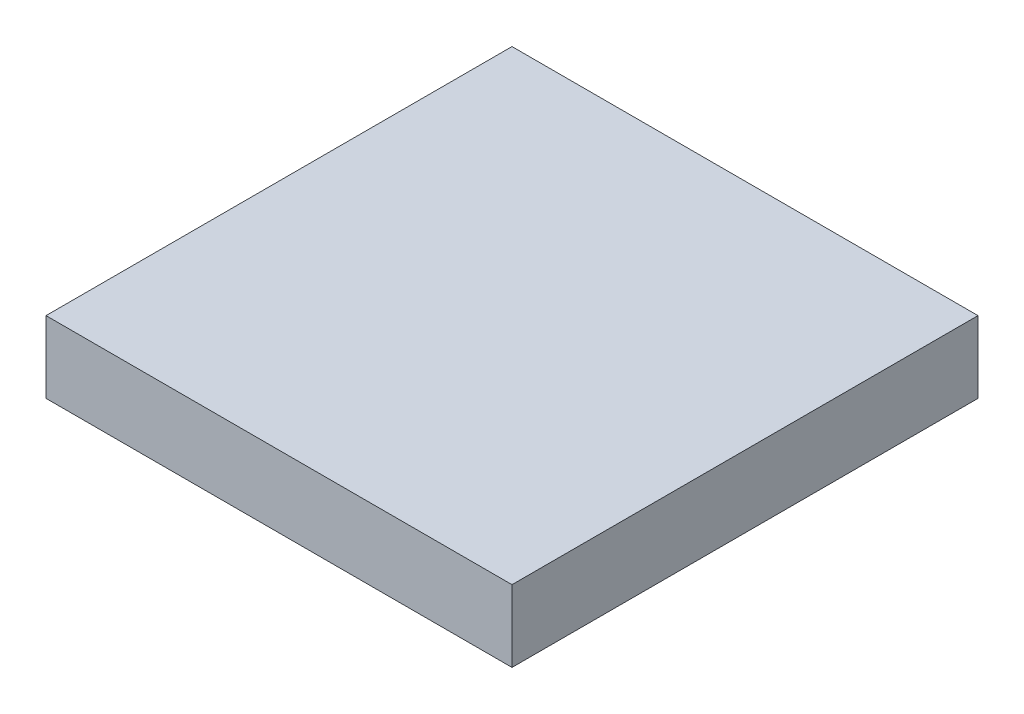
ISO-10303-21;
HEADER;
FILE_DESCRIPTION(('STEP AP214'),'2;1');
FILE_NAME('part.step','',(''),(''),'','','');
FILE_SCHEMA(('AUTOMOTIVE_DESIGN { 1 0 10303 214 1 1 1 1 }'));
ENDSEC;
DATA;
#1=APPLICATION_CONTEXT('core data for automotive mechanical design processes');
#2=APPLICATION_PROTOCOL_DEFINITION('international standard','automotive_design',2000,#1);
#3=PRODUCT_CONTEXT('',#1,'mechanical');
#4=PRODUCT('Part','Part','',(#3));
#5=PRODUCT_RELATED_PRODUCT_CATEGORY('part','',(#4));
#6=PRODUCT_DEFINITION_FORMATION('','',#4);
#7=PRODUCT_DEFINITION_CONTEXT('part definition',#1,'design');
#8=PRODUCT_DEFINITION('design','',#6,#7);
#9=PRODUCT_DEFINITION_SHAPE('','',#8);
#10=(LENGTH_UNIT() NAMED_UNIT(*) SI_UNIT(.MILLI.,.METRE.));
#11=(NAMED_UNIT(*) PLANE_ANGLE_UNIT() SI_UNIT($,.RADIAN.));
#12=(NAMED_UNIT(*) SI_UNIT($,.STERADIAN.) SOLID_ANGLE_UNIT());
#13=UNCERTAINTY_MEASURE_WITH_UNIT(LENGTH_MEASURE(1.E-05),#10,'distance_accuracy_value','');
#14=(GEOMETRIC_REPRESENTATION_CONTEXT(3) GLOBAL_UNCERTAINTY_ASSIGNED_CONTEXT((#13)) GLOBAL_UNIT_ASSIGNED_CONTEXT((#10,
#11,#12)) REPRESENTATION_CONTEXT('',''));
#15=CARTESIAN_POINT('',(0.,0.,0.));
#16=DIRECTION('',(0.,0.,1.));
#17=DIRECTION('',(1.,0.,0.));
#18=AXIS2_PLACEMENT_3D('',#15,#16,#17);
#19=CARTESIAN_POINT('',(0.,0.,0.));
#20=DIRECTION('',(0.,-1.,0.));
#21=DIRECTION('',(0.,0.,-1.));
#22=AXIS2_PLACEMENT_3D('',#19,#20,#21);
#23=PLANE('',#22);
#24=DIRECTION('',(0.,0.,-1.));
#25=VECTOR('',#24,1.);
#26=CARTESIAN_POINT('',(8.255,0.,8.255));
#27=LINE('',#26,#25);
#28=CARTESIAN_POINT('',(8.255,0.,8.255));
#29=VERTEX_POINT('',#28);
#30=CARTESIAN_POINT('',(8.255,0.,-8.255));
#31=VERTEX_POINT('',#30);
#32=EDGE_CURVE('E202',#29,#31,#27,.T.);
#33=ORIENTED_EDGE('',*,*,#32,.F.);
#34=DIRECTION('',(1.,0.,0.));
#35=VECTOR('',#34,1.);
#36=CARTESIAN_POINT('',(-8.255,0.,8.255));
#37=LINE('',#36,#35);
#38=CARTESIAN_POINT('',(-8.255,0.,8.255));
#39=VERTEX_POINT('',#38);
#40=EDGE_CURVE('E208',#39,#29,#37,.T.);
#41=ORIENTED_EDGE('',*,*,#40,.F.);
#42=DIRECTION('',(0.,0.,1.));
#43=VECTOR('',#42,1.);
#44=CARTESIAN_POINT('',(-8.255,0.,8.255));
#45=LINE('',#44,#43);
#46=CARTESIAN_POINT('',(-8.255,0.,-8.255));
#47=VERTEX_POINT('',#46);
#48=EDGE_CURVE('E224',#47,#39,#45,.T.);
#49=ORIENTED_EDGE('',*,*,#48,.F.);
#50=DIRECTION('',(-1.,0.,0.));
#51=VECTOR('',#50,1.);
#52=CARTESIAN_POINT('',(-8.255,0.,-8.255));
#53=LINE('',#52,#51);
#54=EDGE_CURVE('E221',#31,#47,#53,.T.);
#55=ORIENTED_EDGE('',*,*,#54,.F.);
#56=EDGE_LOOP('',(#33,#41,#49,#55));
#57=FACE_BOUND('',#56,.T.);
#58=DIRECTION('',(-1.,0.,0.));
#59=VECTOR('',#58,1.);
#60=CARTESIAN_POINT('',(-4.953,0.,-2.41299999999999));
#61=LINE('',#60,#59);
#62=CARTESIAN_POINT('',(-3.937,0.,-2.41299999999999));
#63=VERTEX_POINT('',#62);
#64=CARTESIAN_POINT('',(-4.953,0.,-2.41299999999999));
#65=VERTEX_POINT('',#64);
#66=EDGE_CURVE('E163',#63,#65,#61,.T.);
#67=ORIENTED_EDGE('',*,*,#66,.F.);
#68=DIRECTION('',(0.,0.,1.));
#69=VECTOR('',#68,1.);
#70=CARTESIAN_POINT('',(-3.937,0.,-5.71499999999999));
#71=LINE('',#70,#69);
#72=CARTESIAN_POINT('',(-3.937,0.,-5.71499999999999));
#73=VERTEX_POINT('',#72);
#74=EDGE_CURVE('E158',#73,#63,#71,.T.);
#75=ORIENTED_EDGE('',*,*,#74,.F.);
#76=DIRECTION('',(1.,0.,0.));
#77=VECTOR('',#76,1.);
#78=CARTESIAN_POINT('',(-4.953,0.,-5.71499999999999));
#79=LINE('',#78,#77);
#80=CARTESIAN_POINT('',(-4.953,0.,-5.71499999999999));
#81=VERTEX_POINT('',#80);
#82=EDGE_CURVE('E173',#81,#73,#79,.T.);
#83=ORIENTED_EDGE('',*,*,#82,.F.);
#84=DIRECTION('',(0.,0.,-1.));
#85=VECTOR('',#84,1.);
#86=CARTESIAN_POINT('',(-4.953,0.,-5.71499999999999));
#87=LINE('',#86,#85);
#88=EDGE_CURVE('E185',#65,#81,#87,.T.);
#89=ORIENTED_EDGE('',*,*,#88,.F.);
#90=EDGE_LOOP('',(#67,#75,#83,#89));
#91=FACE_BOUND('',#90,.T.);
#92=DIRECTION('',(-1.,0.,0.));
#93=VECTOR('',#92,1.);
#94=CARTESIAN_POINT('',(2.413,0.,4.953));
#95=LINE('',#94,#93);
#96=CARTESIAN_POINT('',(5.715,0.,4.953));
#97=VERTEX_POINT('',#96);
#98=CARTESIAN_POINT('',(2.413,0.,4.953));
#99=VERTEX_POINT('',#98);
#100=EDGE_CURVE('E405',#97,#99,#95,.T.);
#101=ORIENTED_EDGE('',*,*,#100,.F.);
#102=DIRECTION('',(0.,0.,1.));
#103=VECTOR('',#102,1.);
#104=CARTESIAN_POINT('',(5.715,0.,3.937));
#105=LINE('',#104,#103);
#106=CARTESIAN_POINT('',(5.715,0.,3.937));
#107=VERTEX_POINT('',#106);
#108=EDGE_CURVE('E155',#107,#97,#105,.T.);
#109=ORIENTED_EDGE('',*,*,#108,.F.);
#110=DIRECTION('',(1.,0.,0.));
#111=VECTOR('',#110,1.);
#112=CARTESIAN_POINT('',(2.413,0.,3.937));
#113=LINE('',#112,#111);
#114=CARTESIAN_POINT('',(2.413,0.,3.937));
#115=VERTEX_POINT('',#114);
#116=EDGE_CURVE('E151',#115,#107,#113,.T.);
#117=ORIENTED_EDGE('',*,*,#116,.F.);
#118=DIRECTION('',(0.,0.,-1.));
#119=VECTOR('',#118,1.);
#120=CARTESIAN_POINT('',(2.413,0.,3.937));
#121=LINE('',#120,#119);
#122=EDGE_CURVE('E401',#99,#115,#121,.T.);
#123=ORIENTED_EDGE('',*,*,#122,.F.);
#124=EDGE_LOOP('',(#101,#109,#117,#123));
#125=FACE_BOUND('',#124,.T.);
#126=ADVANCED_FACE('F39',(#57,#91,#125),#23,.T.);
#127=CARTESIAN_POINT('',(8.255,2.54,8.255));
#128=DIRECTION('',(-1.,0.,0.));
#129=DIRECTION('',(0.,0.,1.));
#130=AXIS2_PLACEMENT_3D('',#127,#128,#129);
#131=PLANE('',#130);
#132=ORIENTED_EDGE('',*,*,#32,.T.);
#133=DIRECTION('',(0.,-1.,0.));
#134=VECTOR('',#133,1.);
#135=CARTESIAN_POINT('',(8.255,2.54,-8.255));
#136=LINE('',#135,#134);
#137=CARTESIAN_POINT('',(8.255,2.54,-8.255));
#138=VERTEX_POINT('',#137);
#139=EDGE_CURVE('E11',#138,#31,#136,.T.);
#140=ORIENTED_EDGE('',*,*,#139,.F.);
#141=DIRECTION('',(0.,0.,-1.));
#142=VECTOR('',#141,1.);
#143=CARTESIAN_POINT('',(8.255,2.54,8.255));
#144=LINE('',#143,#142);
#145=CARTESIAN_POINT('',(8.255,2.54,8.255));
#146=VERTEX_POINT('',#145);
#147=EDGE_CURVE('E203',#146,#138,#144,.T.);
#148=ORIENTED_EDGE('',*,*,#147,.F.);
#149=DIRECTION('',(0.,-1.,0.));
#150=VECTOR('',#149,1.);
#151=CARTESIAN_POINT('',(8.255,2.54,8.255));
#152=LINE('',#151,#150);
#153=EDGE_CURVE('E217',#146,#29,#152,.T.);
#154=ORIENTED_EDGE('',*,*,#153,.T.);
#155=EDGE_LOOP('',(#132,#140,#148,#154));
#156=FACE_BOUND('',#155,.T.);
#157=ADVANCED_FACE('F41',(#156),#131,.F.);
#158=CARTESIAN_POINT('',(-8.255,2.54,-8.255));
#159=DIRECTION('',(0.,0.,1.));
#160=DIRECTION('',(1.,0.,0.));
#161=AXIS2_PLACEMENT_3D('',#158,#159,#160);
#162=PLANE('',#161);
#163=ORIENTED_EDGE('',*,*,#54,.T.);
#164=DIRECTION('',(0.,-1.,0.));
#165=VECTOR('',#164,1.);
#166=CARTESIAN_POINT('',(-8.255,2.54,-8.255));
#167=LINE('',#166,#165);
#168=CARTESIAN_POINT('',(-8.255,2.54,-8.255));
#169=VERTEX_POINT('',#168);
#170=EDGE_CURVE('E48',#169,#47,#167,.T.);
#171=ORIENTED_EDGE('',*,*,#170,.F.);
#172=DIRECTION('',(-1.,0.,0.));
#173=VECTOR('',#172,1.);
#174=CARTESIAN_POINT('',(-8.255,2.54,-8.255));
#175=LINE('',#174,#173);
#176=EDGE_CURVE('E207',#138,#169,#175,.T.);
#177=ORIENTED_EDGE('',*,*,#176,.F.);
#178=ORIENTED_EDGE('',*,*,#139,.T.);
#179=EDGE_LOOP('',(#163,#171,#177,#178));
#180=FACE_BOUND('',#179,.T.);
#181=ADVANCED_FACE('F257',(#180),#162,.F.);
#182=CARTESIAN_POINT('',(-8.255,2.54,8.255));
#183=DIRECTION('',(1.,0.,0.));
#184=DIRECTION('',(0.,0.,-1.));
#185=AXIS2_PLACEMENT_3D('',#182,#183,#184);
#186=PLANE('',#185);
#187=ORIENTED_EDGE('',*,*,#48,.T.);
#188=DIRECTION('',(0.,-1.,0.));
#189=VECTOR('',#188,1.);
#190=CARTESIAN_POINT('',(-8.255,2.54,8.255));
#191=LINE('',#190,#189);
#192=CARTESIAN_POINT('',(-8.255,2.54,8.255));
#193=VERTEX_POINT('',#192);
#194=EDGE_CURVE('E232',#193,#39,#191,.T.);
#195=ORIENTED_EDGE('',*,*,#194,.F.);
#196=DIRECTION('',(0.,0.,1.));
#197=VECTOR('',#196,1.);
#198=CARTESIAN_POINT('',(-8.255,2.54,8.255));
#199=LINE('',#198,#197);
#200=EDGE_CURVE('E211',#169,#193,#199,.T.);
#201=ORIENTED_EDGE('',*,*,#200,.F.);
#202=ORIENTED_EDGE('',*,*,#170,.T.);
#203=EDGE_LOOP('',(#187,#195,#201,#202));
#204=FACE_BOUND('',#203,.T.);
#205=ADVANCED_FACE('F241',(#204),#186,.F.);
#206=CARTESIAN_POINT('',(-8.255,2.54,8.255));
#207=DIRECTION('',(0.,0.,-1.));
#208=DIRECTION('',(-1.,0.,0.));
#209=AXIS2_PLACEMENT_3D('',#206,#207,#208);
#210=PLANE('',#209);
#211=ORIENTED_EDGE('',*,*,#40,.T.);
#212=ORIENTED_EDGE('',*,*,#153,.F.);
#213=DIRECTION('',(1.,0.,0.));
#214=VECTOR('',#213,1.);
#215=CARTESIAN_POINT('',(-8.255,2.54,8.255));
#216=LINE('',#215,#214);
#217=EDGE_CURVE('E214',#193,#146,#216,.T.);
#218=ORIENTED_EDGE('',*,*,#217,.F.);
#219=ORIENTED_EDGE('',*,*,#194,.T.);
#220=EDGE_LOOP('',(#211,#212,#218,#219));
#221=FACE_BOUND('',#220,.T.);
#222=ADVANCED_FACE('F250',(#221),#210,.F.);
#223=CARTESIAN_POINT('',(0.,2.54,0.));
#224=DIRECTION('',(0.,-1.,0.));
#225=DIRECTION('',(0.,0.,-1.));
#226=AXIS2_PLACEMENT_3D('',#223,#224,#225);
#227=PLANE('',#226);
#228=ORIENTED_EDGE('',*,*,#147,.T.);
#229=ORIENTED_EDGE('',*,*,#176,.T.);
#230=ORIENTED_EDGE('',*,*,#200,.T.);
#231=ORIENTED_EDGE('',*,*,#217,.T.);
#232=EDGE_LOOP('',(#228,#229,#230,#231));
#233=FACE_BOUND('',#232,.T.);
#234=ADVANCED_FACE('F256',(#233),#227,.F.);
#235=CARTESIAN_POINT('',(-3.937,-2.032,-5.71499999999999));
#236=DIRECTION('',(-1.,0.,0.));
#237=DIRECTION('',(0.,0.,1.));
#238=AXIS2_PLACEMENT_3D('',#235,#236,#237);
#239=PLANE('',#238);
#240=ORIENTED_EDGE('',*,*,#74,.T.);
#241=DIRECTION('',(0.,1.,0.));
#242=VECTOR('',#241,1.);
#243=CARTESIAN_POINT('',(-3.937,-2.032,-2.41299999999999));
#244=LINE('',#243,#242);
#245=CARTESIAN_POINT('',(-3.937,-2.032,-2.41299999999999));
#246=VERTEX_POINT('',#245);
#247=EDGE_CURVE('E199',#246,#63,#244,.T.);
#248=ORIENTED_EDGE('',*,*,#247,.F.);
#249=DIRECTION('',(0.,0.,1.));
#250=VECTOR('',#249,1.);
#251=CARTESIAN_POINT('',(-3.937,-2.032,-5.71499999999999));
#252=LINE('',#251,#250);
#253=CARTESIAN_POINT('',(-3.937,-2.032,-5.71499999999999));
#254=VERTEX_POINT('',#253);
#255=EDGE_CURVE('E168',#254,#246,#252,.T.);
#256=ORIENTED_EDGE('',*,*,#255,.F.);
#257=DIRECTION('',(0.,1.,0.));
#258=VECTOR('',#257,1.);
#259=CARTESIAN_POINT('',(-3.937,-2.032,-5.71499999999999));
#260=LINE('',#259,#258);
#261=EDGE_CURVE('E181',#254,#73,#260,.T.);
#262=ORIENTED_EDGE('',*,*,#261,.T.);
#263=EDGE_LOOP('',(#240,#248,#256,#262));
#264=FACE_BOUND('',#263,.T.);
#265=ADVANCED_FACE('F275',(#264),#239,.F.);
#266=CARTESIAN_POINT('',(-4.953,-2.032,-2.41299999999999));
#267=DIRECTION('',(0.,0.,-1.));
#268=DIRECTION('',(-1.,0.,0.));
#269=AXIS2_PLACEMENT_3D('',#266,#267,#268);
#270=PLANE('',#269);
#271=ORIENTED_EDGE('',*,*,#66,.T.);
#272=DIRECTION('',(0.,1.,0.));
#273=VECTOR('',#272,1.);
#274=CARTESIAN_POINT('',(-4.953,-2.032,-2.41299999999999));
#275=LINE('',#274,#273);
#276=CARTESIAN_POINT('',(-4.953,-2.032,-2.41299999999999));
#277=VERTEX_POINT('',#276);
#278=EDGE_CURVE('E195',#277,#65,#275,.T.);
#279=ORIENTED_EDGE('',*,*,#278,.F.);
#280=DIRECTION('',(-1.,0.,0.));
#281=VECTOR('',#280,1.);
#282=CARTESIAN_POINT('',(-4.953,-2.032,-2.41299999999999));
#283=LINE('',#282,#281);
#284=EDGE_CURVE('E172',#246,#277,#283,.T.);
#285=ORIENTED_EDGE('',*,*,#284,.F.);
#286=ORIENTED_EDGE('',*,*,#247,.T.);
#287=EDGE_LOOP('',(#271,#279,#285,#286));
#288=FACE_BOUND('',#287,.T.);
#289=ADVANCED_FACE('F279',(#288),#270,.F.);
#290=CARTESIAN_POINT('',(-4.953,-2.032,-5.71499999999999));
#291=DIRECTION('',(1.,0.,0.));
#292=DIRECTION('',(0.,0.,-1.));
#293=AXIS2_PLACEMENT_3D('',#290,#291,#292);
#294=PLANE('',#293);
#295=ORIENTED_EDGE('',*,*,#88,.T.);
#296=DIRECTION('',(0.,1.,0.));
#297=VECTOR('',#296,1.);
#298=CARTESIAN_POINT('',(-4.953,-2.032,-5.71499999999999));
#299=LINE('',#298,#297);
#300=CARTESIAN_POINT('',(-4.953,-2.032,-5.71499999999999));
#301=VERTEX_POINT('',#300);
#302=EDGE_CURVE('E63',#301,#81,#299,.T.);
#303=ORIENTED_EDGE('',*,*,#302,.F.);
#304=DIRECTION('',(0.,0.,-1.));
#305=VECTOR('',#304,1.);
#306=CARTESIAN_POINT('',(-4.953,-2.032,-5.71499999999999));
#307=LINE('',#306,#305);
#308=EDGE_CURVE('E176',#277,#301,#307,.T.);
#309=ORIENTED_EDGE('',*,*,#308,.F.);
#310=ORIENTED_EDGE('',*,*,#278,.T.);
#311=EDGE_LOOP('',(#295,#303,#309,#310));
#312=FACE_BOUND('',#311,.T.);
#313=ADVANCED_FACE('F284',(#312),#294,.F.);
#314=CARTESIAN_POINT('',(-4.953,-2.032,-5.71499999999999));
#315=DIRECTION('',(0.,0.,1.));
#316=DIRECTION('',(1.,0.,0.));
#317=AXIS2_PLACEMENT_3D('',#314,#315,#316);
#318=PLANE('',#317);
#319=ORIENTED_EDGE('',*,*,#82,.T.);
#320=ORIENTED_EDGE('',*,*,#261,.F.);
#321=DIRECTION('',(1.,0.,0.));
#322=VECTOR('',#321,1.);
#323=CARTESIAN_POINT('',(-4.953,-2.032,-5.71499999999999));
#324=LINE('',#323,#322);
#325=EDGE_CURVE('E179',#301,#254,#324,.T.);
#326=ORIENTED_EDGE('',*,*,#325,.F.);
#327=ORIENTED_EDGE('',*,*,#302,.T.);
#328=EDGE_LOOP('',(#319,#320,#326,#327));
#329=FACE_BOUND('',#328,.T.);
#330=ADVANCED_FACE('F290',(#329),#318,.F.);
#331=CARTESIAN_POINT('',(0.,-2.032,0.));
#332=DIRECTION('',(0.,1.,0.));
#333=DIRECTION('',(0.,0.,1.));
#334=AXIS2_PLACEMENT_3D('',#331,#332,#333);
#335=PLANE('',#334);
#336=ORIENTED_EDGE('',*,*,#255,.T.);
#337=ORIENTED_EDGE('',*,*,#284,.T.);
#338=ORIENTED_EDGE('',*,*,#308,.T.);
#339=ORIENTED_EDGE('',*,*,#325,.T.);
#340=EDGE_LOOP('',(#336,#337,#338,#339));
#341=FACE_BOUND('',#340,.T.);
#342=ADVANCED_FACE('F294',(#341),#335,.F.);
#343=CARTESIAN_POINT('',(5.715,-2.032,3.937));
#344=DIRECTION('',(-1.,0.,0.));
#345=DIRECTION('',(0.,0.,1.));
#346=AXIS2_PLACEMENT_3D('',#343,#344,#345);
#347=PLANE('',#346);
#348=ORIENTED_EDGE('',*,*,#108,.T.);
#349=DIRECTION('',(0.,1.,0.));
#350=VECTOR('',#349,1.);
#351=CARTESIAN_POINT('',(5.715,-2.032,4.953));
#352=LINE('',#351,#350);
#353=CARTESIAN_POINT('',(5.715,-2.032,4.953));
#354=VERTEX_POINT('',#353);
#355=EDGE_CURVE('E134',#354,#97,#352,.T.);
#356=ORIENTED_EDGE('',*,*,#355,.F.);
#357=DIRECTION('',(0.,0.,1.));
#358=VECTOR('',#357,1.);
#359=CARTESIAN_POINT('',(5.715,-2.032,3.937));
#360=LINE('',#359,#358);
#361=CARTESIAN_POINT('',(5.715,-2.032,3.937));
#362=VERTEX_POINT('',#361);
#363=EDGE_CURVE('E142',#362,#354,#360,.T.);
#364=ORIENTED_EDGE('',*,*,#363,.F.);
#365=DIRECTION('',(0.,1.,0.));
#366=VECTOR('',#365,1.);
#367=CARTESIAN_POINT('',(5.715,-2.032,3.937));
#368=LINE('',#367,#366);
#369=EDGE_CURVE('E397',#362,#107,#368,.T.);
#370=ORIENTED_EDGE('',*,*,#369,.T.);
#371=EDGE_LOOP('',(#348,#356,#364,#370));
#372=FACE_BOUND('',#371,.T.);
#373=ADVANCED_FACE('F153',(#372),#347,.F.);
#374=CARTESIAN_POINT('',(2.413,-2.032,4.953));
#375=DIRECTION('',(0.,0.,-1.));
#376=DIRECTION('',(-1.,0.,0.));
#377=AXIS2_PLACEMENT_3D('',#374,#375,#376);
#378=PLANE('',#377);
#379=ORIENTED_EDGE('',*,*,#100,.T.);
#380=DIRECTION('',(0.,1.,0.));
#381=VECTOR('',#380,1.);
#382=CARTESIAN_POINT('',(2.413,-2.032,4.953));
#383=LINE('',#382,#381);
#384=CARTESIAN_POINT('',(2.413,-2.032,4.953));
#385=VERTEX_POINT('',#384);
#386=EDGE_CURVE('E137',#385,#99,#383,.T.);
#387=ORIENTED_EDGE('',*,*,#386,.F.);
#388=DIRECTION('',(-1.,0.,0.));
#389=VECTOR('',#388,1.);
#390=CARTESIAN_POINT('',(2.413,-2.032,4.953));
#391=LINE('',#390,#389);
#392=EDGE_CURVE('E130',#354,#385,#391,.T.);
#393=ORIENTED_EDGE('',*,*,#392,.F.);
#394=ORIENTED_EDGE('',*,*,#355,.T.);
#395=EDGE_LOOP('',(#379,#387,#393,#394));
#396=FACE_BOUND('',#395,.T.);
#397=ADVANCED_FACE('F132',(#396),#378,.F.);
#398=CARTESIAN_POINT('',(2.413,-2.032,3.937));
#399=DIRECTION('',(1.,0.,0.));
#400=DIRECTION('',(0.,0.,-1.));
#401=AXIS2_PLACEMENT_3D('',#398,#399,#400);
#402=PLANE('',#401);
#403=ORIENTED_EDGE('',*,*,#122,.T.);
#404=DIRECTION('',(0.,1.,0.));
#405=VECTOR('',#404,1.);
#406=CARTESIAN_POINT('',(2.413,-2.032,3.937));
#407=LINE('',#406,#405);
#408=CARTESIAN_POINT('',(2.413,-2.032,3.937));
#409=VERTEX_POINT('',#408);
#410=EDGE_CURVE('E55',#409,#115,#407,.T.);
#411=ORIENTED_EDGE('',*,*,#410,.F.);
#412=DIRECTION('',(0.,0.,-1.));
#413=VECTOR('',#412,1.);
#414=CARTESIAN_POINT('',(2.413,-2.032,3.937));
#415=LINE('',#414,#413);
#416=EDGE_CURVE('E141',#385,#409,#415,.T.);
#417=ORIENTED_EDGE('',*,*,#416,.F.);
#418=ORIENTED_EDGE('',*,*,#386,.T.);
#419=EDGE_LOOP('',(#403,#411,#417,#418));
#420=FACE_BOUND('',#419,.T.);
#421=ADVANCED_FACE('F302',(#420),#402,.F.);
#422=CARTESIAN_POINT('',(2.413,-2.032,3.937));
#423=DIRECTION('',(0.,0.,1.));
#424=DIRECTION('',(1.,0.,0.));
#425=AXIS2_PLACEMENT_3D('',#422,#423,#424);
#426=PLANE('',#425);
#427=ORIENTED_EDGE('',*,*,#116,.T.);
#428=ORIENTED_EDGE('',*,*,#369,.F.);
#429=DIRECTION('',(1.,0.,0.));
#430=VECTOR('',#429,1.);
#431=CARTESIAN_POINT('',(2.413,-2.032,3.937));
#432=LINE('',#431,#430);
#433=EDGE_CURVE('E146',#409,#362,#432,.T.);
#434=ORIENTED_EDGE('',*,*,#433,.F.);
#435=ORIENTED_EDGE('',*,*,#410,.T.);
#436=EDGE_LOOP('',(#427,#428,#434,#435));
#437=FACE_BOUND('',#436,.T.);
#438=ADVANCED_FACE('F305',(#437),#426,.F.);
#439=CARTESIAN_POINT('',(0.,-2.032,0.));
#440=DIRECTION('',(0.,1.,0.));
#441=DIRECTION('',(0.,0.,1.));
#442=AXIS2_PLACEMENT_3D('',#439,#440,#441);
#443=PLANE('',#442);
#444=ORIENTED_EDGE('',*,*,#363,.T.);
#445=ORIENTED_EDGE('',*,*,#392,.T.);
#446=ORIENTED_EDGE('',*,*,#416,.T.);
#447=ORIENTED_EDGE('',*,*,#433,.T.);
#448=EDGE_LOOP('',(#444,#445,#446,#447));
#449=FACE_BOUND('',#448,.T.);
#450=ADVANCED_FACE('F145',(#449),#443,.F.);
#451=CLOSED_SHELL('',(#126,#157,#181,#205,#222,#234,#265,#289,#313,#330,#342,#373,#397,#421,
#438,#450));
#452=MANIFOLD_SOLID_BREP('B2',#451);
#453=ADVANCED_BREP_SHAPE_REPRESENTATION('',(#18,#452),#14);
#454=SHAPE_DEFINITION_REPRESENTATION(#9,#453);
ENDSEC;
END-ISO-10303-21;
